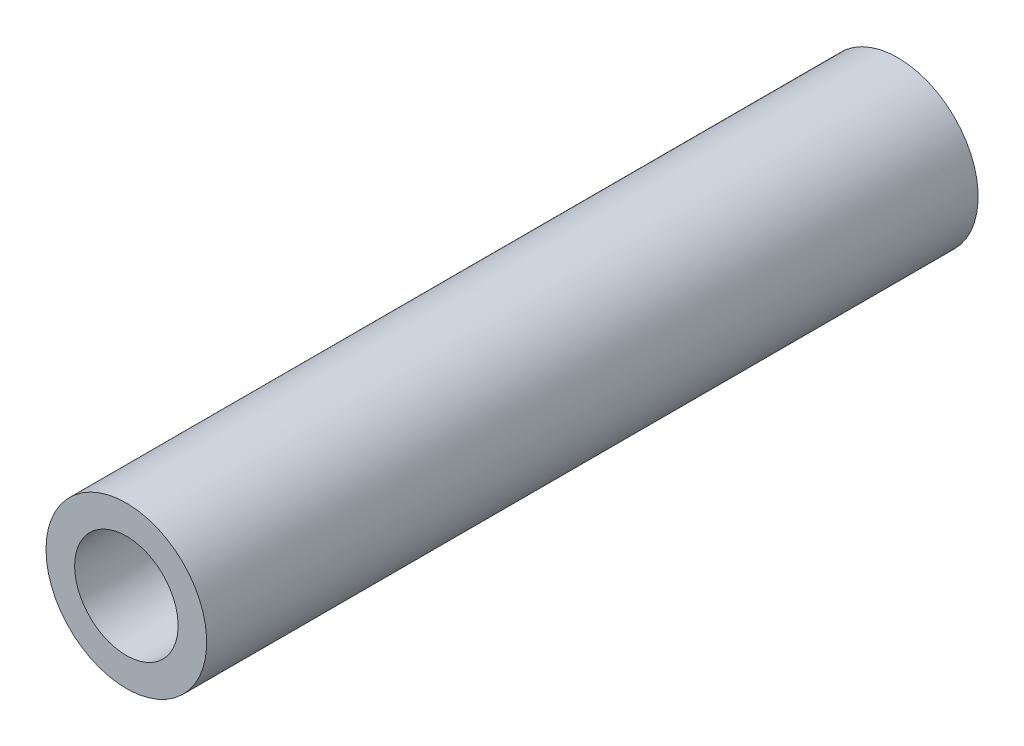
ISO-10303-21;
HEADER;
FILE_DESCRIPTION(('STEP AP214'),'2;1');
FILE_NAME('part.step','',(''),(''),'','','');
FILE_SCHEMA(('AUTOMOTIVE_DESIGN { 1 0 10303 214 1 1 1 1 }'));
ENDSEC;
DATA;
#1=APPLICATION_CONTEXT('core data for automotive mechanical design processes');
#2=APPLICATION_PROTOCOL_DEFINITION('international standard','automotive_design',2000,#1);
#3=PRODUCT_CONTEXT('',#1,'mechanical');
#4=PRODUCT('Part','Part','',(#3));
#5=PRODUCT_RELATED_PRODUCT_CATEGORY('part','',(#4));
#6=PRODUCT_DEFINITION_FORMATION('','',#4);
#7=PRODUCT_DEFINITION_CONTEXT('part definition',#1,'design');
#8=PRODUCT_DEFINITION('design','',#6,#7);
#9=PRODUCT_DEFINITION_SHAPE('','',#8);
#10=(LENGTH_UNIT() NAMED_UNIT(*) SI_UNIT(.MILLI.,.METRE.));
#11=(NAMED_UNIT(*) PLANE_ANGLE_UNIT() SI_UNIT($,.RADIAN.));
#12=(NAMED_UNIT(*) SI_UNIT($,.STERADIAN.) SOLID_ANGLE_UNIT());
#13=UNCERTAINTY_MEASURE_WITH_UNIT(LENGTH_MEASURE(1.E-05),#10,'distance_accuracy_value','');
#14=(GEOMETRIC_REPRESENTATION_CONTEXT(3) GLOBAL_UNCERTAINTY_ASSIGNED_CONTEXT((#13)) GLOBAL_UNIT_ASSIGNED_CONTEXT((#10,
#11,#12)) REPRESENTATION_CONTEXT('',''));
#15=CARTESIAN_POINT('',(0.,0.,0.));
#16=DIRECTION('',(0.,0.,1.));
#17=DIRECTION('',(1.,0.,0.));
#18=AXIS2_PLACEMENT_3D('',#15,#16,#17);
#19=CARTESIAN_POINT('',(0.,0.,38.1));
#20=DIRECTION('',(0.,0.,1.));
#21=DIRECTION('',(1.,0.,0.));
#22=AXIS2_PLACEMENT_3D('',#19,#20,#21);
#23=PLANE('',#22);
#24=CARTESIAN_POINT('',(0.,0.,38.1));
#25=DIRECTION('',(0.,0.,1.));
#26=DIRECTION('',(1.,0.,0.));
#27=AXIS2_PLACEMENT_3D('',#24,#25,#26);
#28=CIRCLE('',#27,3.96875);
#29=CARTESIAN_POINT('',(-3.96875,0.,38.1));
#30=VERTEX_POINT('',#29);
#31=EDGE_CURVE('E12',#30,#30,#28,.T.);
#32=ORIENTED_EDGE('',*,*,#31,.T.);
#33=EDGE_LOOP('',(#32));
#34=FACE_BOUND('',#33,.T.);
#35=CARTESIAN_POINT('',(0.,0.,38.1));
#36=DIRECTION('',(0.,0.,1.));
#37=DIRECTION('',(1.,0.,0.));
#38=AXIS2_PLACEMENT_3D('',#35,#36,#37);
#39=CIRCLE('',#38,2.555);
#40=CARTESIAN_POINT('',(-2.555,0.,38.1));
#41=VERTEX_POINT('',#40);
#42=EDGE_CURVE('E57',#41,#41,#39,.T.);
#43=ORIENTED_EDGE('',*,*,#42,.F.);
#44=EDGE_LOOP('',(#43));
#45=FACE_BOUND('',#44,.T.);
#46=ADVANCED_FACE('F46',(#34,#45),#23,.T.);
#47=CARTESIAN_POINT('',(0.,0.,0.));
#48=DIRECTION('',(0.,0.,1.));
#49=DIRECTION('',(1.,0.,0.));
#50=AXIS2_PLACEMENT_3D('',#47,#48,#49);
#51=PLANE('',#50);
#52=CARTESIAN_POINT('',(0.,0.,0.));
#53=DIRECTION('',(0.,0.,1.));
#54=DIRECTION('',(1.,0.,0.));
#55=AXIS2_PLACEMENT_3D('',#52,#53,#54);
#56=CIRCLE('',#55,3.96875);
#57=CARTESIAN_POINT('',(-3.96875,0.,0.));
#58=VERTEX_POINT('',#57);
#59=EDGE_CURVE('E50',#58,#58,#56,.T.);
#60=ORIENTED_EDGE('',*,*,#59,.F.);
#61=EDGE_LOOP('',(#60));
#62=FACE_BOUND('',#61,.T.);
#63=CARTESIAN_POINT('',(0.,0.,0.));
#64=DIRECTION('',(0.,0.,1.));
#65=DIRECTION('',(1.,0.,0.));
#66=AXIS2_PLACEMENT_3D('',#63,#64,#65);
#67=CIRCLE('',#66,2.555);
#68=CARTESIAN_POINT('',(-2.555,0.,0.));
#69=VERTEX_POINT('',#68);
#70=EDGE_CURVE('E59',#69,#69,#67,.T.);
#71=ORIENTED_EDGE('',*,*,#70,.T.);
#72=EDGE_LOOP('',(#71));
#73=FACE_BOUND('',#72,.T.);
#74=ADVANCED_FACE('F69',(#62,#73),#51,.F.);
#75=CARTESIAN_POINT('',(0.,0.,38.1));
#76=DIRECTION('',(0.,0.,-1.));
#77=DIRECTION('',(-1.,0.,0.));
#78=AXIS2_PLACEMENT_3D('',#75,#76,#77);
#79=CYLINDRICAL_SURFACE('',#78,3.96875);
#80=CARTESIAN_POINT('',(-3.96875,0.,38.1));
#81=CARTESIAN_POINT('',(-3.96875,0.,37.703125));
#82=CARTESIAN_POINT('',(-3.96875,0.,37.30625));
#83=CARTESIAN_POINT('',(-3.96875,0.,36.5125));
#84=CARTESIAN_POINT('',(-3.96875,0.,36.115625));
#85=CARTESIAN_POINT('',(-3.96875,0.,35.321875));
#86=CARTESIAN_POINT('',(-3.96875,0.,34.925));
#87=CARTESIAN_POINT('',(-3.96875,0.,34.13125));
#88=CARTESIAN_POINT('',(-3.96875,0.,33.734375));
#89=CARTESIAN_POINT('',(-3.96875,0.,32.940625));
#90=CARTESIAN_POINT('',(-3.96875,0.,32.54375));
#91=CARTESIAN_POINT('',(-3.96875,0.,31.75));
#92=CARTESIAN_POINT('',(-3.96875,0.,31.353125));
#93=CARTESIAN_POINT('',(-3.96875,0.,30.559375));
#94=CARTESIAN_POINT('',(-3.96875,0.,30.1625));
#95=CARTESIAN_POINT('',(-3.96875,0.,29.36875));
#96=CARTESIAN_POINT('',(-3.96875,0.,28.971875));
#97=CARTESIAN_POINT('',(-3.96875,0.,28.178125));
#98=CARTESIAN_POINT('',(-3.96875,0.,27.78125));
#99=CARTESIAN_POINT('',(-3.96875,0.,26.9875));
#100=CARTESIAN_POINT('',(-3.96875,0.,26.590625));
#101=CARTESIAN_POINT('',(-3.96875,0.,25.796875));
#102=CARTESIAN_POINT('',(-3.96875,0.,25.4));
#103=CARTESIAN_POINT('',(-3.96875,0.,24.60625));
#104=CARTESIAN_POINT('',(-3.96875,0.,24.209375));
#105=CARTESIAN_POINT('',(-3.96875,0.,23.415625));
#106=CARTESIAN_POINT('',(-3.96875,0.,23.01875));
#107=CARTESIAN_POINT('',(-3.96875,0.,22.225));
#108=CARTESIAN_POINT('',(-3.96875,0.,21.828125));
#109=CARTESIAN_POINT('',(-3.96875,0.,21.034375));
#110=CARTESIAN_POINT('',(-3.96875,0.,20.6375));
#111=CARTESIAN_POINT('',(-3.96875,0.,19.84375));
#112=CARTESIAN_POINT('',(-3.96875,0.,19.446875));
#113=CARTESIAN_POINT('',(-3.96875,0.,18.653125));
#114=CARTESIAN_POINT('',(-3.96875,0.,18.25625));
#115=CARTESIAN_POINT('',(-3.96875,0.,17.4625));
#116=CARTESIAN_POINT('',(-3.96875,0.,17.065625));
#117=CARTESIAN_POINT('',(-3.96875,0.,16.271875));
#118=CARTESIAN_POINT('',(-3.96875,0.,15.875));
#119=CARTESIAN_POINT('',(-3.96875,0.,15.08125));
#120=CARTESIAN_POINT('',(-3.96875,0.,14.684375));
#121=CARTESIAN_POINT('',(-3.96875,0.,13.890625));
#122=CARTESIAN_POINT('',(-3.96875,0.,13.49375));
#123=CARTESIAN_POINT('',(-3.96875,0.,12.7));
#124=CARTESIAN_POINT('',(-3.96875,0.,12.303125));
#125=CARTESIAN_POINT('',(-3.96875,0.,11.509375));
#126=CARTESIAN_POINT('',(-3.96875,0.,11.1125));
#127=CARTESIAN_POINT('',(-3.96875,0.,10.31875));
#128=CARTESIAN_POINT('',(-3.96875,0.,9.92187499999999));
#129=CARTESIAN_POINT('',(-3.96875,0.,9.12812499999999));
#130=CARTESIAN_POINT('',(-3.96875,0.,8.73124999999999));
#131=CARTESIAN_POINT('',(-3.96875,0.,7.93749999999999));
#132=CARTESIAN_POINT('',(-3.96875,0.,7.54062499999999));
#133=CARTESIAN_POINT('',(-3.96875,0.,6.74687499999999));
#134=CARTESIAN_POINT('',(-3.96875,0.,6.34999999999999));
#135=CARTESIAN_POINT('',(-3.96875,0.,5.55625));
#136=CARTESIAN_POINT('',(-3.96875,0.,5.159375));
#137=CARTESIAN_POINT('',(-3.96875,0.,4.365625));
#138=CARTESIAN_POINT('',(-3.96875,0.,3.96875));
#139=CARTESIAN_POINT('',(-3.96875,0.,3.17499999999999));
#140=CARTESIAN_POINT('',(-3.96875,0.,2.77812499999999));
#141=CARTESIAN_POINT('',(-3.96875,0.,1.98437499999999));
#142=CARTESIAN_POINT('',(-3.96875,0.,1.58749999999999));
#143=CARTESIAN_POINT('',(-3.96875,0.,0.793749999999994));
#144=CARTESIAN_POINT('',(-3.96875,0.,0.396874999999993));
#145=CARTESIAN_POINT('',(-3.96875,0.,0.));
#146=B_SPLINE_CURVE_WITH_KNOTS('',3,(#80,#81,#82,#83,#84,#85,#86,#87,#88,#89,#90,#91,#92,#93,
#94,#95,#96,#97,#98,#99,#100,#101,#102,#103,#104,#105,#106,#107,#108,#109,#110,#111,#112,#113,
#114,#115,#116,#117,#118,#119,#120,#121,#122,#123,#124,#125,#126,#127,#128,#129,#130,#131,#132,
#133,#134,#135,#136,#137,#138,#139,#140,#141,#142,#143,#144,#145),.UNSPECIFIED.,.F.,.F.,(4,2,2,
2,2,2,2,2,2,2,2,2,2,2,2,2,2,2,2,2,2,2,2,2,2,2,2,2,2,2,2,2,4),(0.,1.190625,2.38125,3.571875,
4.7625,5.953125,7.14375,8.334375,9.52500000000001,10.715625,11.90625,13.096875,14.2875,
15.478125,16.66875,17.859375,19.05,20.240625,21.43125,22.621875,23.8125,25.003125,26.19375,
27.384375,28.575,29.765625,30.95625,32.146875,33.3375,34.528125,35.71875,36.909375,38.1),.UNSPECIFIED.);
#147=EDGE_CURVE('BSEAM48',#30,#58,#146,.T.);
#148=ORIENTED_EDGE('',*,*,#31,.F.);
#149=ORIENTED_EDGE('',*,*,#59,.T.);
#150=ORIENTED_EDGE('',*,*,#147,.T.);
#151=ORIENTED_EDGE('',*,*,#147,.F.);
#152=EDGE_LOOP('',(#148,#150,#149,#151));
#153=FACE_BOUND('',#152,.T.);
#154=ADVANCED_FACE('F48',(#153),#79,.T.);
#155=CARTESIAN_POINT('',(0.,0.,38.1));
#156=DIRECTION('',(0.,0.,-1.));
#157=DIRECTION('',(-1.,0.,0.));
#158=AXIS2_PLACEMENT_3D('',#155,#156,#157);
#159=CYLINDRICAL_SURFACE('',#158,2.555);
#160=CARTESIAN_POINT('',(-2.555,0.,38.1));
#161=CARTESIAN_POINT('',(-2.555,0.,37.703125));
#162=CARTESIAN_POINT('',(-2.555,0.,37.30625));
#163=CARTESIAN_POINT('',(-2.555,0.,36.5125));
#164=CARTESIAN_POINT('',(-2.555,0.,36.115625));
#165=CARTESIAN_POINT('',(-2.555,0.,35.321875));
#166=CARTESIAN_POINT('',(-2.555,0.,34.925));
#167=CARTESIAN_POINT('',(-2.555,0.,34.13125));
#168=CARTESIAN_POINT('',(-2.555,0.,33.734375));
#169=CARTESIAN_POINT('',(-2.555,0.,32.940625));
#170=CARTESIAN_POINT('',(-2.555,0.,32.54375));
#171=CARTESIAN_POINT('',(-2.555,0.,31.75));
#172=CARTESIAN_POINT('',(-2.555,0.,31.353125));
#173=CARTESIAN_POINT('',(-2.555,0.,30.559375));
#174=CARTESIAN_POINT('',(-2.555,0.,30.1625));
#175=CARTESIAN_POINT('',(-2.555,0.,29.36875));
#176=CARTESIAN_POINT('',(-2.555,0.,28.971875));
#177=CARTESIAN_POINT('',(-2.555,0.,28.178125));
#178=CARTESIAN_POINT('',(-2.555,0.,27.78125));
#179=CARTESIAN_POINT('',(-2.555,0.,26.9875));
#180=CARTESIAN_POINT('',(-2.555,0.,26.590625));
#181=CARTESIAN_POINT('',(-2.555,0.,25.796875));
#182=CARTESIAN_POINT('',(-2.555,0.,25.4));
#183=CARTESIAN_POINT('',(-2.555,0.,24.60625));
#184=CARTESIAN_POINT('',(-2.555,0.,24.209375));
#185=CARTESIAN_POINT('',(-2.555,0.,23.415625));
#186=CARTESIAN_POINT('',(-2.555,0.,23.01875));
#187=CARTESIAN_POINT('',(-2.555,0.,22.225));
#188=CARTESIAN_POINT('',(-2.555,0.,21.828125));
#189=CARTESIAN_POINT('',(-2.555,0.,21.034375));
#190=CARTESIAN_POINT('',(-2.555,0.,20.6375));
#191=CARTESIAN_POINT('',(-2.555,0.,19.84375));
#192=CARTESIAN_POINT('',(-2.555,0.,19.446875));
#193=CARTESIAN_POINT('',(-2.555,0.,18.653125));
#194=CARTESIAN_POINT('',(-2.555,0.,18.25625));
#195=CARTESIAN_POINT('',(-2.555,0.,17.4625));
#196=CARTESIAN_POINT('',(-2.555,0.,17.065625));
#197=CARTESIAN_POINT('',(-2.555,0.,16.271875));
#198=CARTESIAN_POINT('',(-2.555,0.,15.875));
#199=CARTESIAN_POINT('',(-2.555,0.,15.08125));
#200=CARTESIAN_POINT('',(-2.555,0.,14.684375));
#201=CARTESIAN_POINT('',(-2.555,0.,13.890625));
#202=CARTESIAN_POINT('',(-2.555,0.,13.49375));
#203=CARTESIAN_POINT('',(-2.555,0.,12.7));
#204=CARTESIAN_POINT('',(-2.555,0.,12.303125));
#205=CARTESIAN_POINT('',(-2.555,0.,11.509375));
#206=CARTESIAN_POINT('',(-2.555,0.,11.1125));
#207=CARTESIAN_POINT('',(-2.555,0.,10.31875));
#208=CARTESIAN_POINT('',(-2.555,0.,9.92187499999999));
#209=CARTESIAN_POINT('',(-2.555,0.,9.12812499999999));
#210=CARTESIAN_POINT('',(-2.555,0.,8.73124999999999));
#211=CARTESIAN_POINT('',(-2.555,0.,7.93749999999999));
#212=CARTESIAN_POINT('',(-2.555,0.,7.54062499999999));
#213=CARTESIAN_POINT('',(-2.555,0.,6.74687499999999));
#214=CARTESIAN_POINT('',(-2.555,0.,6.34999999999999));
#215=CARTESIAN_POINT('',(-2.555,0.,5.55625));
#216=CARTESIAN_POINT('',(-2.555,0.,5.159375));
#217=CARTESIAN_POINT('',(-2.555,0.,4.365625));
#218=CARTESIAN_POINT('',(-2.555,0.,3.96875));
#219=CARTESIAN_POINT('',(-2.555,0.,3.17499999999999));
#220=CARTESIAN_POINT('',(-2.555,0.,2.77812499999999));
#221=CARTESIAN_POINT('',(-2.555,0.,1.98437499999999));
#222=CARTESIAN_POINT('',(-2.555,0.,1.58749999999999));
#223=CARTESIAN_POINT('',(-2.555,0.,0.793749999999994));
#224=CARTESIAN_POINT('',(-2.555,0.,0.396874999999993));
#225=CARTESIAN_POINT('',(-2.555,0.,0.));
#226=B_SPLINE_CURVE_WITH_KNOTS('',3,(#160,#161,#162,#163,#164,#165,#166,#167,#168,#169,#170,
#171,#172,#173,#174,#175,#176,#177,#178,#179,#180,#181,#182,#183,#184,#185,#186,#187,#188,#189,
#190,#191,#192,#193,#194,#195,#196,#197,#198,#199,#200,#201,#202,#203,#204,#205,#206,#207,#208,
#209,#210,#211,#212,#213,#214,#215,#216,#217,#218,#219,#220,#221,#222,#223,#224,#225),
.UNSPECIFIED.,.F.,.F.,(4,2,2,2,2,2,2,2,2,2,2,2,2,2,2,2,2,2,2,2,2,2,2,2,2,2,2,2,2,2,2,2,4),(0.,
1.190625,2.38125,3.571875,4.7625,5.953125,7.14375,8.334375,9.52500000000001,10.715625,11.90625,
13.096875,14.2875,15.478125,16.66875,17.859375,19.05,20.240625,21.43125,22.621875,23.8125,
25.003125,26.19375,27.384375,28.575,29.765625,30.95625,32.146875,33.3375,34.528125,35.71875,
36.909375,38.1),.UNSPECIFIED.);
#227=EDGE_CURVE('BSEAM65',#41,#69,#226,.T.);
#228=ORIENTED_EDGE('',*,*,#42,.T.);
#229=ORIENTED_EDGE('',*,*,#70,.F.);
#230=ORIENTED_EDGE('',*,*,#227,.T.);
#231=ORIENTED_EDGE('',*,*,#227,.F.);
#232=EDGE_LOOP('',(#228,#230,#229,#231));
#233=FACE_BOUND('',#232,.T.);
#234=ADVANCED_FACE('F65',(#233),#159,.F.);
#235=CLOSED_SHELL('',(#46,#74,#154,#234));
#236=MANIFOLD_SOLID_BREP('B2',#235);
#237=ADVANCED_BREP_SHAPE_REPRESENTATION('',(#18,#236),#14);
#238=SHAPE_DEFINITION_REPRESENTATION(#9,#237);
ENDSEC;
END-ISO-10303-21;
